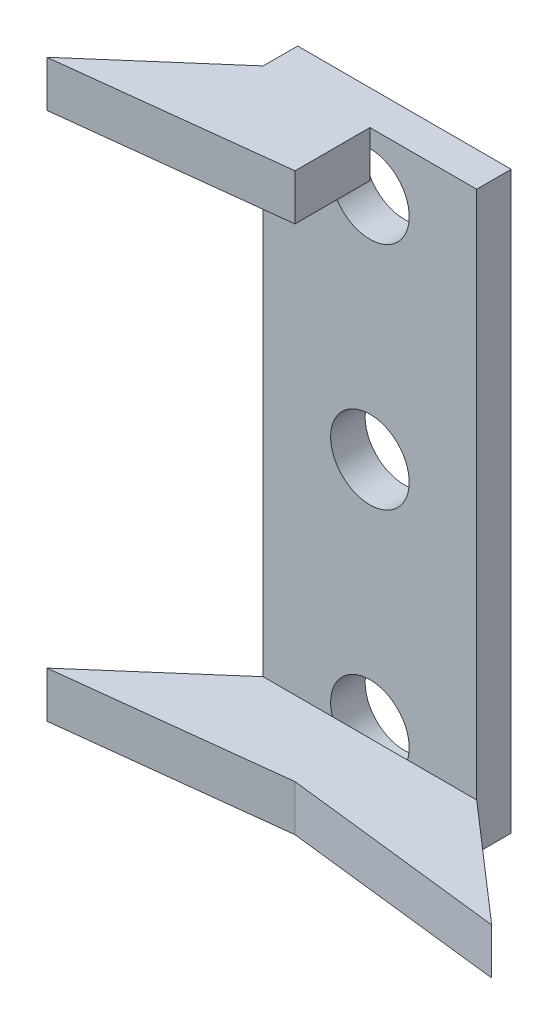
ISO-10303-21;
HEADER;
FILE_DESCRIPTION(('STEP AP214'),'2;1');
FILE_NAME('part.step','',(''),(''),'','','');
FILE_SCHEMA(('AUTOMOTIVE_DESIGN { 1 0 10303 214 1 1 1 1 }'));
ENDSEC;
DATA;
#1=APPLICATION_CONTEXT('core data for automotive mechanical design processes');
#2=APPLICATION_PROTOCOL_DEFINITION('international standard','automotive_design',2000,#1);
#3=PRODUCT_CONTEXT('',#1,'mechanical');
#4=PRODUCT('Part','Part','',(#3));
#5=PRODUCT_RELATED_PRODUCT_CATEGORY('part','',(#4));
#6=PRODUCT_DEFINITION_FORMATION('','',#4);
#7=PRODUCT_DEFINITION_CONTEXT('part definition',#1,'design');
#8=PRODUCT_DEFINITION('design','',#6,#7);
#9=PRODUCT_DEFINITION_SHAPE('','',#8);
#10=(LENGTH_UNIT() NAMED_UNIT(*) SI_UNIT(.MILLI.,.METRE.));
#11=(NAMED_UNIT(*) PLANE_ANGLE_UNIT() SI_UNIT($,.RADIAN.));
#12=(NAMED_UNIT(*) SI_UNIT($,.STERADIAN.) SOLID_ANGLE_UNIT());
#13=UNCERTAINTY_MEASURE_WITH_UNIT(LENGTH_MEASURE(1.E-05),#10,'distance_accuracy_value','');
#14=(GEOMETRIC_REPRESENTATION_CONTEXT(3) GLOBAL_UNCERTAINTY_ASSIGNED_CONTEXT((#13)) GLOBAL_UNIT_ASSIGNED_CONTEXT((#10,
#11,#12)) REPRESENTATION_CONTEXT('',''));
#15=CARTESIAN_POINT('',(0.,0.,0.));
#16=DIRECTION('',(0.,0.,1.));
#17=DIRECTION('',(1.,0.,0.));
#18=AXIS2_PLACEMENT_3D('',#15,#16,#17);
#19=CARTESIAN_POINT('',(-147.00484014835,40.,54.9741091967513));
#20=DIRECTION('',(-0.115020986115073,0.,-0.993363061902906));
#21=DIRECTION('',(-0.993363061902906,0.,0.115020986115073));
#22=AXIS2_PLACEMENT_3D('',#19,#20,#21);
#23=PLANE('',#22);
#24=DIRECTION('',(0.993363061902906,0.,-0.115020986115073));
#25=VECTOR('',#24,1.);
#26=CARTESIAN_POINT('',(-147.00484014835,0.,54.9741091967513));
#27=LINE('',#26,#25);
#28=CARTESIAN_POINT('',(-147.00484014835,0.,54.9741091967513));
#29=VERTEX_POINT('',#28);
#30=CARTESIAN_POINT('',(46.4225810994789,0.,32.5772498943712));
#31=VERTEX_POINT('',#30);
#32=EDGE_CURVE('E233',#29,#31,#27,.T.);
#33=ORIENTED_EDGE('',*,*,#32,.T.);
#34=DIRECTION('',(0.,-1.,0.));
#35=VECTOR('',#34,1.);
#36=CARTESIAN_POINT('',(46.4225810994789,40.,32.5772498943712));
#37=LINE('',#36,#35);
#38=CARTESIAN_POINT('',(46.4225810994789,40.,32.5772498943712));
#39=VERTEX_POINT('',#38);
#40=EDGE_CURVE('E44',#39,#31,#37,.T.);
#41=ORIENTED_EDGE('',*,*,#40,.F.);
#42=DIRECTION('',(0.993363061902906,0.,-0.115020986115073));
#43=VECTOR('',#42,1.);
#44=CARTESIAN_POINT('',(-147.00484014835,40.,54.9741091967513));
#45=LINE('',#44,#43);
#46=CARTESIAN_POINT('',(-147.00484014835,40.,54.9741091967513));
#47=VERTEX_POINT('',#46);
#48=EDGE_CURVE('E234',#47,#39,#45,.T.);
#49=ORIENTED_EDGE('',*,*,#48,.F.);
#50=DIRECTION('',(0.,-1.,0.));
#51=VECTOR('',#50,1.);
#52=CARTESIAN_POINT('',(-147.00484014835,40.,54.9741091967513));
#53=LINE('',#52,#51);
#54=EDGE_CURVE('E244',#47,#29,#53,.T.);
#55=ORIENTED_EDGE('',*,*,#54,.T.);
#56=EDGE_LOOP('',(#33,#41,#49,#55));
#57=FACE_BOUND('',#56,.T.);
#58=ADVANCED_FACE('F37',(#57),#23,.F.);
#59=CARTESIAN_POINT('',(-46.4225810994789,40.,-32.5772498943712));
#60=DIRECTION('',(0.656556653543438,0.,0.754276713605717));
#61=DIRECTION('',(0.754276713605717,0.,-0.656556653543438));
#62=AXIS2_PLACEMENT_3D('',#59,#60,#61);
#63=PLANE('',#62);
#64=DIRECTION('',(-0.754276713605717,0.,0.656556653543438));
#65=VECTOR('',#64,1.);
#66=CARTESIAN_POINT('',(-46.4225810994789,0.,-32.5772498943712));
#67=LINE('',#66,#65);
#68=CARTESIAN_POINT('',(-46.4225810994789,0.,-32.5772498943712));
#69=VERTEX_POINT('',#68);
#70=EDGE_CURVE('E237',#69,#29,#67,.T.);
#71=ORIENTED_EDGE('',*,*,#70,.T.);
#72=ORIENTED_EDGE('',*,*,#54,.F.);
#73=DIRECTION('',(-0.754276713605717,0.,0.656556653543438));
#74=VECTOR('',#73,1.);
#75=CARTESIAN_POINT('',(-46.4225810994789,40.,-32.5772498943712));
#76=LINE('',#75,#74);
#77=CARTESIAN_POINT('',(-46.4225810994789,40.,-32.5772498943712));
#78=VERTEX_POINT('',#77);
#79=EDGE_CURVE('E241',#78,#47,#76,.T.);
#80=ORIENTED_EDGE('',*,*,#79,.F.);
#81=DIRECTION('',(0.,-1.,0.));
#82=VECTOR('',#81,1.);
#83=CARTESIAN_POINT('',(-46.4225810994789,40.,-32.5772498943712));
#84=LINE('',#83,#82);
#85=EDGE_CURVE('E249',#78,#69,#84,.T.);
#86=ORIENTED_EDGE('',*,*,#85,.T.);
#87=EDGE_LOOP('',(#71,#72,#80,#86));
#88=FACE_BOUND('',#87,.T.);
#89=ADVANCED_FACE('F275',(#88),#63,.F.);
#90=CARTESIAN_POINT('',(0.,40.,0.));
#91=DIRECTION('',(0.,-1.,0.));
#92=DIRECTION('',(0.,0.,-1.));
#93=AXIS2_PLACEMENT_3D('',#90,#91,#92);
#94=PLANE('',#93);
#95=ORIENTED_EDGE('',*,*,#48,.T.);
#96=DIRECTION('',(-0.993363061902906,0.,-0.115020986115073));
#97=VECTOR('',#96,1.);
#98=CARTESIAN_POINT('',(239.850002347308,40.,54.9741091967513));
#99=LINE('',#98,#97);
#100=CARTESIAN_POINT('',(239.850002347308,40.,54.9741091967513));
#101=VERTEX_POINT('',#100);
#102=EDGE_CURVE('E218',#101,#39,#99,.T.);
#103=ORIENTED_EDGE('',*,*,#102,.F.);
#104=DIRECTION('',(0.754276713605717,0.,0.656556653543438));
#105=VECTOR('',#104,1.);
#106=CARTESIAN_POINT('',(139.267743298437,40.,-32.5772498943712));
#107=LINE('',#106,#105);
#108=CARTESIAN_POINT('',(139.267743298437,40.,-32.5772498943712));
#109=VERTEX_POINT('',#108);
#110=EDGE_CURVE('E221',#109,#101,#107,.T.);
#111=ORIENTED_EDGE('',*,*,#110,.F.);
#112=DIRECTION('',(-1.,0.,0.));
#113=VECTOR('',#112,1.);
#114=CARTESIAN_POINT('',(-46.4225810994789,40.,-32.5772498943712));
#115=LINE('',#114,#113);
#116=CARTESIAN_POINT('',(79.102818327294,40.,-32.5772498943712));
#117=VERTEX_POINT('',#116);
#118=EDGE_CURVE('E238',#109,#117,#115,.T.);
#119=ORIENTED_EDGE('',*,*,#118,.T.);
#120=CARTESIAN_POINT('',(13.7423438716637,40.,-32.5772498943712));
#121=VERTEX_POINT('',#120);
#122=EDGE_CURVE('E242',#117,#121,#115,.T.);
#123=ORIENTED_EDGE('',*,*,#122,.T.);
#124=EDGE_CURVE('E236',#121,#78,#115,.T.);
#125=ORIENTED_EDGE('',*,*,#124,.T.);
#126=ORIENTED_EDGE('',*,*,#79,.T.);
#127=EDGE_LOOP('',(#95,#103,#111,#119,#123,#125,#126));
#128=FACE_BOUND('',#127,.T.);
#129=ADVANCED_FACE('F271',(#128),#94,.F.);
#130=CARTESIAN_POINT('',(0.,0.,0.));
#131=DIRECTION('',(0.,-1.,0.));
#132=DIRECTION('',(0.,0.,-1.));
#133=AXIS2_PLACEMENT_3D('',#130,#131,#132);
#134=PLANE('',#133);
#135=ORIENTED_EDGE('',*,*,#32,.F.);
#136=ORIENTED_EDGE('',*,*,#70,.F.);
#137=DIRECTION('',(0.,0.,1.));
#138=VECTOR('',#137,1.);
#139=CARTESIAN_POINT('',(-46.4225810994789,0.,-62.5772498943712));
#140=LINE('',#139,#138);
#141=CARTESIAN_POINT('',(-46.4225810994789,0.,-62.5772498943712));
#142=VERTEX_POINT('',#141);
#143=EDGE_CURVE('E201',#142,#69,#140,.T.);
#144=ORIENTED_EDGE('',*,*,#143,.F.);
#145=DIRECTION('',(-1.,0.,0.));
#146=VECTOR('',#145,1.);
#147=CARTESIAN_POINT('',(-46.4225810994789,0.,-62.5772498943712));
#148=LINE('',#147,#146);
#149=CARTESIAN_POINT('',(139.267743298437,0.,-62.5772498943712));
#150=VERTEX_POINT('',#149);
#151=EDGE_CURVE('E199',#150,#142,#148,.T.);
#152=ORIENTED_EDGE('',*,*,#151,.F.);
#153=DIRECTION('',(0.,0.,1.));
#154=VECTOR('',#153,1.);
#155=CARTESIAN_POINT('',(139.267743298437,0.,-62.5772498943712));
#156=LINE('',#155,#154);
#157=CARTESIAN_POINT('',(139.267743298437,0.,-32.5772498943712));
#158=VERTEX_POINT('',#157);
#159=EDGE_CURVE('E208',#150,#158,#156,.T.);
#160=ORIENTED_EDGE('',*,*,#159,.T.);
#161=DIRECTION('',(0.754276713605717,0.,0.656556653543438));
#162=VECTOR('',#161,1.);
#163=CARTESIAN_POINT('',(139.267743298437,0.,-32.5772498943712));
#164=LINE('',#163,#162);
#165=CARTESIAN_POINT('',(239.850002347308,0.,54.9741091967513));
#166=VERTEX_POINT('',#165);
#167=EDGE_CURVE('E222',#158,#166,#164,.T.);
#168=ORIENTED_EDGE('',*,*,#167,.T.);
#169=DIRECTION('',(-0.993363061902906,0.,-0.115020986115073));
#170=VECTOR('',#169,1.);
#171=CARTESIAN_POINT('',(239.850002347308,0.,54.9741091967513));
#172=LINE('',#171,#170);
#173=EDGE_CURVE('E217',#166,#31,#172,.T.);
#174=ORIENTED_EDGE('',*,*,#173,.T.);
#175=EDGE_LOOP('',(#135,#136,#144,#152,#160,#168,#174));
#176=FACE_BOUND('',#175,.T.);
#177=ADVANCED_FACE('F261',(#176),#134,.T.);
#178=CARTESIAN_POINT('',(239.850002347308,40.,54.9741091967513));
#179=DIRECTION('',(-0.115020986115073,0.,0.993363061902906));
#180=DIRECTION('',(0.993363061902906,0.,0.115020986115073));
#181=AXIS2_PLACEMENT_3D('',#178,#179,#180);
#182=PLANE('',#181);
#183=ORIENTED_EDGE('',*,*,#173,.F.);
#184=DIRECTION('',(0.,-1.,0.));
#185=VECTOR('',#184,1.);
#186=CARTESIAN_POINT('',(239.850002347308,40.,54.9741091967513));
#187=LINE('',#186,#185);
#188=EDGE_CURVE('E231',#101,#166,#187,.T.);
#189=ORIENTED_EDGE('',*,*,#188,.F.);
#190=ORIENTED_EDGE('',*,*,#102,.T.);
#191=ORIENTED_EDGE('',*,*,#40,.T.);
#192=EDGE_LOOP('',(#183,#189,#190,#191));
#193=FACE_BOUND('',#192,.T.);
#194=ADVANCED_FACE('F255',(#193),#182,.T.);
#195=CARTESIAN_POINT('',(139.267743298437,40.,-32.5772498943712));
#196=DIRECTION('',(0.656556653543438,0.,-0.754276713605717));
#197=DIRECTION('',(-0.754276713605717,0.,-0.656556653543438));
#198=AXIS2_PLACEMENT_3D('',#195,#196,#197);
#199=PLANE('',#198);
#200=ORIENTED_EDGE('',*,*,#167,.F.);
#201=DIRECTION('',(0.,-1.,0.));
#202=VECTOR('',#201,1.);
#203=CARTESIAN_POINT('',(139.267743298437,40.,-32.5772498943712));
#204=LINE('',#203,#202);
#205=EDGE_CURVE('E225',#109,#158,#204,.T.);
#206=ORIENTED_EDGE('',*,*,#205,.F.);
#207=ORIENTED_EDGE('',*,*,#110,.T.);
#208=ORIENTED_EDGE('',*,*,#188,.T.);
#209=EDGE_LOOP('',(#200,#206,#207,#208));
#210=FACE_BOUND('',#209,.T.);
#211=ADVANCED_FACE('F268',(#210),#199,.T.);
#212=CARTESIAN_POINT('',(-46.4225810994789,0.,-62.5772498943712));
#213=DIRECTION('',(1.,0.,0.));
#214=DIRECTION('',(0.,0.,-1.));
#215=AXIS2_PLACEMENT_3D('',#212,#213,#214);
#216=PLANE('',#215);
#217=ORIENTED_EDGE('',*,*,#85,.F.);
#218=DIRECTION('',(0.,1.,0.));
#219=VECTOR('',#218,1.);
#220=CARTESIAN_POINT('',(-46.4225810994789,0.,-32.5772498943712));
#221=LINE('',#220,#219);
#222=CARTESIAN_POINT('',(-46.4225810994789,460.,-32.5772498943712));
#223=VERTEX_POINT('',#222);
#224=EDGE_CURVE('E190',#78,#223,#221,.T.);
#225=ORIENTED_EDGE('',*,*,#224,.T.);
#226=DIRECTION('',(0.,1.,0.));
#227=VECTOR('',#226,1.);
#228=CARTESIAN_POINT('',(-46.4225810994789,460.,-32.5772498943712));
#229=LINE('',#228,#227);
#230=CARTESIAN_POINT('',(-46.4225810994789,500.,-32.5772498943712));
#231=VERTEX_POINT('',#230);
#232=EDGE_CURVE('E185',#223,#231,#229,.T.);
#233=ORIENTED_EDGE('',*,*,#232,.T.);
#234=DIRECTION('',(0.,0.,1.));
#235=VECTOR('',#234,1.);
#236=CARTESIAN_POINT('',(-46.4225810994789,500.,-62.5772498943712));
#237=LINE('',#236,#235);
#238=CARTESIAN_POINT('',(-46.4225810994789,500.,-62.5772498943712));
#239=VERTEX_POINT('',#238);
#240=EDGE_CURVE('E214',#239,#231,#237,.T.);
#241=ORIENTED_EDGE('',*,*,#240,.F.);
#242=DIRECTION('',(0.,1.,0.));
#243=VECTOR('',#242,1.);
#244=CARTESIAN_POINT('',(-46.4225810994789,0.,-62.5772498943712));
#245=LINE('',#244,#243);
#246=EDGE_CURVE('E191',#142,#239,#245,.T.);
#247=ORIENTED_EDGE('',*,*,#246,.F.);
#248=ORIENTED_EDGE('',*,*,#143,.T.);
#249=EDGE_LOOP('',(#217,#225,#233,#241,#247,#248));
#250=FACE_BOUND('',#249,.T.);
#251=ADVANCED_FACE('F281',(#250),#216,.F.);
#252=CARTESIAN_POINT('',(-46.4225810994789,500.,-62.5772498943712));
#253=DIRECTION('',(0.,-1.,0.));
#254=DIRECTION('',(0.,0.,-1.));
#255=AXIS2_PLACEMENT_3D('',#252,#253,#254);
#256=PLANE('',#255);
#257=ORIENTED_EDGE('',*,*,#240,.T.);
#258=DIRECTION('',(-0.754276713605717,0.,0.656556653543438));
#259=VECTOR('',#258,1.);
#260=CARTESIAN_POINT('',(-46.4225810994789,500.,-32.5772498943712));
#261=LINE('',#260,#259);
#262=CARTESIAN_POINT('',(-147.00484014835,500.,54.9741091967513));
#263=VERTEX_POINT('',#262);
#264=EDGE_CURVE('E177',#231,#263,#261,.T.);
#265=ORIENTED_EDGE('',*,*,#264,.T.);
#266=DIRECTION('',(0.993363061902906,0.,-0.115020986115073));
#267=VECTOR('',#266,1.);
#268=CARTESIAN_POINT('',(-147.00484014835,500.,54.9741091967513));
#269=LINE('',#268,#267);
#270=CARTESIAN_POINT('',(46.4225810994789,500.,32.5772498943712));
#271=VERTEX_POINT('',#270);
#272=EDGE_CURVE('E174',#263,#271,#269,.T.);
#273=ORIENTED_EDGE('',*,*,#272,.T.);
#274=DIRECTION('',(0.,0.,-1.));
#275=VECTOR('',#274,1.);
#276=CARTESIAN_POINT('',(46.4225810994789,500.,-32.5772498943712));
#277=LINE('',#276,#275);
#278=CARTESIAN_POINT('',(46.4225810994789,500.,-32.5772498943712));
#279=VERTEX_POINT('',#278);
#280=EDGE_CURVE('E181',#271,#279,#277,.T.);
#281=ORIENTED_EDGE('',*,*,#280,.T.);
#282=DIRECTION('',(1.,0.,0.));
#283=VECTOR('',#282,1.);
#284=CARTESIAN_POINT('',(-46.4225810994789,500.,-32.5772498943712));
#285=LINE('',#284,#283);
#286=CARTESIAN_POINT('',(139.267743298437,500.,-32.5772498943712));
#287=VERTEX_POINT('',#286);
#288=EDGE_CURVE('E203',#279,#287,#285,.T.);
#289=ORIENTED_EDGE('',*,*,#288,.T.);
#290=DIRECTION('',(0.,0.,1.));
#291=VECTOR('',#290,1.);
#292=CARTESIAN_POINT('',(139.267743298437,500.,-62.5772498943712));
#293=LINE('',#292,#291);
#294=CARTESIAN_POINT('',(139.267743298437,500.,-62.5772498943712));
#295=VERTEX_POINT('',#294);
#296=EDGE_CURVE('E211',#295,#287,#293,.T.);
#297=ORIENTED_EDGE('',*,*,#296,.F.);
#298=DIRECTION('',(1.,0.,0.));
#299=VECTOR('',#298,1.);
#300=CARTESIAN_POINT('',(-46.4225810994789,500.,-62.5772498943712));
#301=LINE('',#300,#299);
#302=EDGE_CURVE('E194',#239,#295,#301,.T.);
#303=ORIENTED_EDGE('',*,*,#302,.F.);
#304=EDGE_LOOP('',(#257,#265,#273,#281,#289,#297,#303));
#305=FACE_BOUND('',#304,.T.);
#306=ADVANCED_FACE('F296',(#305),#256,.F.);
#307=CARTESIAN_POINT('',(139.267743298437,0.,-62.5772498943712));
#308=DIRECTION('',(-1.,0.,0.));
#309=DIRECTION('',(0.,0.,1.));
#310=AXIS2_PLACEMENT_3D('',#307,#308,#309);
#311=PLANE('',#310);
#312=DIRECTION('',(0.,-1.,0.));
#313=VECTOR('',#312,1.);
#314=CARTESIAN_POINT('',(139.267743298437,0.,-32.5772498943712));
#315=LINE('',#314,#313);
#316=EDGE_CURVE('E195',#287,#109,#315,.T.);
#317=ORIENTED_EDGE('',*,*,#316,.T.);
#318=ORIENTED_EDGE('',*,*,#205,.T.);
#319=ORIENTED_EDGE('',*,*,#159,.F.);
#320=DIRECTION('',(0.,-1.,0.));
#321=VECTOR('',#320,1.);
#322=CARTESIAN_POINT('',(139.267743298437,0.,-62.5772498943712));
#323=LINE('',#322,#321);
#324=EDGE_CURVE('E197',#295,#150,#323,.T.);
#325=ORIENTED_EDGE('',*,*,#324,.F.);
#326=ORIENTED_EDGE('',*,*,#296,.T.);
#327=EDGE_LOOP('',(#317,#318,#319,#325,#326));
#328=FACE_BOUND('',#327,.T.);
#329=ADVANCED_FACE('F287',(#328),#311,.F.);
#330=CARTESIAN_POINT('',(0.,0.,-62.5772498943712));
#331=DIRECTION('',(0.,0.,-1.));
#332=DIRECTION('',(-1.,0.,0.));
#333=AXIS2_PLACEMENT_3D('',#330,#331,#332);
#334=PLANE('',#333);
#335=CARTESIAN_POINT('',(46.4225810994789,50.,-62.5772498943712));
#336=DIRECTION('',(0.,0.,-1.));
#337=DIRECTION('',(-1.,0.,0.));
#338=AXIS2_PLACEMENT_3D('',#335,#336,#337);
#339=CIRCLE('',#338,34.1759843350016);
#340=CARTESIAN_POINT('',(12.2465967644773,50.,-62.5772498943712));
#341=VERTEX_POINT('',#340);
#342=EDGE_CURVE('E153',#341,#341,#339,.T.);
#343=ORIENTED_EDGE('',*,*,#342,.F.);
#344=EDGE_LOOP('',(#343));
#345=FACE_BOUND('',#344,.T.);
#346=CARTESIAN_POINT('',(46.4225810994789,450.,-62.5772498943712));
#347=DIRECTION('',(0.,0.,-1.));
#348=DIRECTION('',(-1.,0.,0.));
#349=AXIS2_PLACEMENT_3D('',#346,#347,#348);
#350=CIRCLE('',#349,34.1759843350016);
#351=CARTESIAN_POINT('',(12.2465967644773,450.,-62.5772498943712));
#352=VERTEX_POINT('',#351);
#353=EDGE_CURVE('E161',#352,#352,#350,.T.);
#354=ORIENTED_EDGE('',*,*,#353,.F.);
#355=EDGE_LOOP('',(#354));
#356=FACE_BOUND('',#355,.T.);
#357=CARTESIAN_POINT('',(46.4225810994789,250.,-62.5772498943712));
#358=DIRECTION('',(0.,0.,-1.));
#359=DIRECTION('',(-1.,0.,0.));
#360=AXIS2_PLACEMENT_3D('',#357,#358,#359);
#361=CIRCLE('',#360,34.1759843350016);
#362=CARTESIAN_POINT('',(12.2465967644773,250.,-62.5772498943712));
#363=VERTEX_POINT('',#362);
#364=EDGE_CURVE('E292',#363,#363,#361,.T.);
#365=ORIENTED_EDGE('',*,*,#364,.F.);
#366=EDGE_LOOP('',(#365));
#367=FACE_BOUND('',#366,.T.);
#368=ORIENTED_EDGE('',*,*,#246,.T.);
#369=ORIENTED_EDGE('',*,*,#302,.T.);
#370=ORIENTED_EDGE('',*,*,#324,.T.);
#371=ORIENTED_EDGE('',*,*,#151,.T.);
#372=EDGE_LOOP('',(#368,#369,#370,#371));
#373=FACE_BOUND('',#372,.T.);
#374=ADVANCED_FACE('F283',(#345,#356,#367,#373),#334,.T.);
#375=CARTESIAN_POINT('',(0.,0.,-32.5772498943712));
#376=DIRECTION('',(0.,0.,-1.));
#377=DIRECTION('',(-1.,0.,0.));
#378=AXIS2_PLACEMENT_3D('',#375,#376,#377);
#379=PLANE('',#378);
#380=CARTESIAN_POINT('',(46.4225810994789,250.,-32.5772498943712));
#381=DIRECTION('',(0.,0.,-1.));
#382=DIRECTION('',(-1.,0.,0.));
#383=AXIS2_PLACEMENT_3D('',#380,#381,#382);
#384=CIRCLE('',#383,34.1759843350016);
#385=CARTESIAN_POINT('',(12.2465967644773,250.,-32.5772498943712));
#386=VERTEX_POINT('',#385);
#387=EDGE_CURVE('E178',#386,#386,#384,.T.);
#388=ORIENTED_EDGE('',*,*,#387,.T.);
#389=EDGE_LOOP('',(#388));
#390=FACE_BOUND('',#389,.T.);
#391=ORIENTED_EDGE('',*,*,#124,.F.);
#392=CARTESIAN_POINT('',(46.4225810994789,50.,-32.5772498943712));
#393=DIRECTION('',(0.,0.,-1.));
#394=DIRECTION('',(-1.,0.,0.));
#395=AXIS2_PLACEMENT_3D('',#392,#393,#394);
#396=CIRCLE('',#395,34.1759843350016);
#397=EDGE_CURVE('E11',#121,#117,#396,.T.);
#398=ORIENTED_EDGE('',*,*,#397,.T.);
#399=ORIENTED_EDGE('',*,*,#118,.F.);
#400=ORIENTED_EDGE('',*,*,#316,.F.);
#401=ORIENTED_EDGE('',*,*,#288,.F.);
#402=DIRECTION('',(0.,1.,0.));
#403=VECTOR('',#402,1.);
#404=CARTESIAN_POINT('',(46.4225810994789,460.,-32.5772498943712));
#405=LINE('',#404,#403);
#406=CARTESIAN_POINT('',(46.4225810994789,484.175984335002,-32.5772498943712));
#407=VERTEX_POINT('',#406);
#408=EDGE_CURVE('E58',#407,#279,#405,.T.);
#409=ORIENTED_EDGE('',*,*,#408,.F.);
#410=CARTESIAN_POINT('',(46.4225810994789,450.,-32.5772498943712));
#411=DIRECTION('',(0.,0.,-1.));
#412=DIRECTION('',(-1.,0.,0.));
#413=AXIS2_PLACEMENT_3D('',#410,#411,#412);
#414=CIRCLE('',#413,34.1759843350016);
#415=CARTESIAN_POINT('',(13.7423438716637,460.,-32.5772498943712));
#416=VERTEX_POINT('',#415);
#417=EDGE_CURVE('E152',#407,#416,#414,.T.);
#418=ORIENTED_EDGE('',*,*,#417,.T.);
#419=DIRECTION('',(-1.,0.,0.));
#420=VECTOR('',#419,1.);
#421=CARTESIAN_POINT('',(-46.4225810994789,460.,-32.5772498943712));
#422=LINE('',#421,#420);
#423=EDGE_CURVE('E146',#416,#223,#422,.T.);
#424=ORIENTED_EDGE('',*,*,#423,.T.);
#425=ORIENTED_EDGE('',*,*,#224,.F.);
#426=EDGE_LOOP('',(#391,#398,#399,#400,#401,#409,#418,#424,#425));
#427=FACE_BOUND('',#426,.T.);
#428=ADVANCED_FACE('F157',(#390,#427),#379,.F.);
#429=CARTESIAN_POINT('',(-147.00484014835,460.,54.9741091967513));
#430=DIRECTION('',(0.115020986115073,0.,0.993363061902906));
#431=DIRECTION('',(0.993363061902906,0.,-0.115020986115073));
#432=AXIS2_PLACEMENT_3D('',#429,#430,#431);
#433=PLANE('',#432);
#434=ORIENTED_EDGE('',*,*,#272,.F.);
#435=DIRECTION('',(0.,1.,0.));
#436=VECTOR('',#435,1.);
#437=CARTESIAN_POINT('',(-147.00484014835,460.,54.9741091967513));
#438=LINE('',#437,#436);
#439=CARTESIAN_POINT('',(-147.00484014835,460.,54.9741091967513));
#440=VERTEX_POINT('',#439);
#441=EDGE_CURVE('E188',#440,#263,#438,.T.);
#442=ORIENTED_EDGE('',*,*,#441,.F.);
#443=DIRECTION('',(0.993363061902906,0.,-0.115020986115073));
#444=VECTOR('',#443,1.);
#445=CARTESIAN_POINT('',(-147.00484014835,460.,54.9741091967513));
#446=LINE('',#445,#444);
#447=CARTESIAN_POINT('',(46.4225810994789,460.,32.5772498943712));
#448=VERTEX_POINT('',#447);
#449=EDGE_CURVE('E168',#440,#448,#446,.T.);
#450=ORIENTED_EDGE('',*,*,#449,.T.);
#451=DIRECTION('',(0.,1.,0.));
#452=VECTOR('',#451,1.);
#453=CARTESIAN_POINT('',(46.4225810994789,460.,32.5772498943712));
#454=LINE('',#453,#452);
#455=EDGE_CURVE('E173',#448,#271,#454,.T.);
#456=ORIENTED_EDGE('',*,*,#455,.T.);
#457=EDGE_LOOP('',(#434,#442,#450,#456));
#458=FACE_BOUND('',#457,.T.);
#459=ADVANCED_FACE('F301',(#458),#433,.T.);
#460=CARTESIAN_POINT('',(-46.4225810994789,460.,-32.5772498943712));
#461=DIRECTION('',(-0.656556653543438,0.,-0.754276713605717));
#462=DIRECTION('',(-0.754276713605717,0.,0.656556653543438));
#463=AXIS2_PLACEMENT_3D('',#460,#461,#462);
#464=PLANE('',#463);
#465=ORIENTED_EDGE('',*,*,#264,.F.);
#466=ORIENTED_EDGE('',*,*,#232,.F.);
#467=DIRECTION('',(-0.754276713605717,0.,0.656556653543438));
#468=VECTOR('',#467,1.);
#469=CARTESIAN_POINT('',(-46.4225810994789,460.,-32.5772498943712));
#470=LINE('',#469,#468);
#471=EDGE_CURVE('E166',#223,#440,#470,.T.);
#472=ORIENTED_EDGE('',*,*,#471,.T.);
#473=ORIENTED_EDGE('',*,*,#441,.T.);
#474=EDGE_LOOP('',(#465,#466,#472,#473));
#475=FACE_BOUND('',#474,.T.);
#476=ADVANCED_FACE('F358',(#475),#464,.T.);
#477=CARTESIAN_POINT('',(46.4225810994789,460.,-32.5772498943712));
#478=DIRECTION('',(1.,0.,0.));
#479=DIRECTION('',(0.,0.,-1.));
#480=AXIS2_PLACEMENT_3D('',#477,#478,#479);
#481=PLANE('',#480);
#482=ORIENTED_EDGE('',*,*,#280,.F.);
#483=ORIENTED_EDGE('',*,*,#455,.F.);
#484=DIRECTION('',(0.,0.,-1.));
#485=VECTOR('',#484,1.);
#486=CARTESIAN_POINT('',(46.4225810994789,460.,-32.5772498943712));
#487=LINE('',#486,#485);
#488=CARTESIAN_POINT('',(46.4225810994789,460.,-32.5772498943712));
#489=VERTEX_POINT('',#488);
#490=EDGE_CURVE('E145',#448,#489,#487,.T.);
#491=ORIENTED_EDGE('',*,*,#490,.T.);
#492=EDGE_CURVE('E140',#489,#407,#405,.T.);
#493=ORIENTED_EDGE('',*,*,#492,.T.);
#494=ORIENTED_EDGE('',*,*,#408,.T.);
#495=EDGE_LOOP('',(#482,#483,#491,#493,#494));
#496=FACE_BOUND('',#495,.T.);
#497=ADVANCED_FACE('F298',(#496),#481,.T.);
#498=CARTESIAN_POINT('',(0.,460.,0.));
#499=DIRECTION('',(0.,1.,0.));
#500=DIRECTION('',(0.,0.,-1.));
#501=AXIS2_PLACEMENT_3D('',#498,#499,#500);
#502=PLANE('',#501);
#503=ORIENTED_EDGE('',*,*,#449,.F.);
#504=ORIENTED_EDGE('',*,*,#471,.F.);
#505=ORIENTED_EDGE('',*,*,#423,.F.);
#506=EDGE_CURVE('E136',#489,#416,#422,.T.);
#507=ORIENTED_EDGE('',*,*,#506,.F.);
#508=ORIENTED_EDGE('',*,*,#490,.F.);
#509=EDGE_LOOP('',(#503,#504,#505,#507,#508));
#510=FACE_BOUND('',#509,.T.);
#511=ADVANCED_FACE('F164',(#510),#502,.F.);
#512=CARTESIAN_POINT('',(46.4225810994789,250.,-32.5772498943712));
#513=DIRECTION('',(0.,0.,-1.));
#514=DIRECTION('',(-1.,0.,0.));
#515=AXIS2_PLACEMENT_3D('',#512,#513,#514);
#516=CYLINDRICAL_SURFACE('',#515,34.1759843350016);
#517=ORIENTED_EDGE('',*,*,#387,.F.);
#518=EDGE_LOOP('',(#517));
#519=FACE_BOUND('',#518,.T.);
#520=ORIENTED_EDGE('',*,*,#364,.T.);
#521=EDGE_LOOP('',(#520));
#522=FACE_BOUND('',#521,.T.);
#523=ADVANCED_FACE('F321',(#519,#522),#516,.F.);
#524=CARTESIAN_POINT('',(46.4225810994789,450.,-32.5772498943712));
#525=DIRECTION('',(0.,0.,-1.));
#526=DIRECTION('',(-1.,0.,0.));
#527=AXIS2_PLACEMENT_3D('',#524,#525,#526);
#528=CYLINDRICAL_SURFACE('',#527,34.1759843350016);
#529=EDGE_CURVE('E139',#416,#407,#414,.T.);
#530=ORIENTED_EDGE('',*,*,#529,.F.);
#531=ORIENTED_EDGE('',*,*,#417,.F.);
#532=EDGE_LOOP('',(#530,#531));
#533=FACE_BOUND('',#532,.T.);
#534=ORIENTED_EDGE('',*,*,#353,.T.);
#535=EDGE_LOOP('',(#534));
#536=FACE_BOUND('',#535,.T.);
#537=ADVANCED_FACE('F150',(#533,#536),#528,.F.);
#538=CARTESIAN_POINT('',(46.4225810994789,450.,-32.5772498943712));
#539=DIRECTION('',(0.,0.,-1.));
#540=DIRECTION('',(-1.,0.,0.));
#541=AXIS2_PLACEMENT_3D('',#538,#539,#540);
#542=PLANE('',#541);
#543=ORIENTED_EDGE('',*,*,#506,.T.);
#544=ORIENTED_EDGE('',*,*,#529,.T.);
#545=ORIENTED_EDGE('',*,*,#492,.F.);
#546=EDGE_LOOP('',(#543,#544,#545));
#547=FACE_BOUND('',#546,.T.);
#548=ADVANCED_FACE('F138',(#547),#542,.T.);
#549=CARTESIAN_POINT('',(46.4225810994789,50.,-32.5772498943712));
#550=DIRECTION('',(0.,0.,-1.));
#551=DIRECTION('',(-1.,0.,0.));
#552=AXIS2_PLACEMENT_3D('',#549,#550,#551);
#553=PLANE('',#552);
#554=ORIENTED_EDGE('',*,*,#122,.F.);
#555=CARTESIAN_POINT('',(46.4225810994789,50.,-32.5772498943712));
#556=DIRECTION('',(0.,0.,-1.));
#557=DIRECTION('',(-1.,0.,0.));
#558=AXIS2_PLACEMENT_3D('',#555,#556,#557);
#559=CIRCLE('',#558,34.1759843350016);
#560=EDGE_CURVE('E50',#117,#121,#559,.T.);
#561=ORIENTED_EDGE('',*,*,#560,.T.);
#562=EDGE_LOOP('',(#554,#561));
#563=FACE_BOUND('',#562,.T.);
#564=ADVANCED_FACE('F291',(#563),#553,.T.);
#565=CARTESIAN_POINT('',(46.4225810994789,50.,-32.5772498943712));
#566=DIRECTION('',(0.,0.,-1.));
#567=DIRECTION('',(-1.,0.,0.));
#568=AXIS2_PLACEMENT_3D('',#565,#566,#567);
#569=CYLINDRICAL_SURFACE('',#568,34.1759843350016);
#570=ORIENTED_EDGE('',*,*,#560,.F.);
#571=ORIENTED_EDGE('',*,*,#397,.F.);
#572=EDGE_LOOP('',(#570,#571));
#573=FACE_BOUND('',#572,.T.);
#574=ORIENTED_EDGE('',*,*,#342,.T.);
#575=EDGE_LOOP('',(#574));
#576=FACE_BOUND('',#575,.T.);
#577=ADVANCED_FACE('F312',(#573,#576),#569,.F.);
#578=CLOSED_SHELL('',(#58,#89,#129,#177,#194,#211,#251,#306,#329,#374,#428,#459,#476,#497,#511,
#523,#537,#548,#564,#577));
#579=MANIFOLD_SOLID_BREP('B2',#578);
#580=ADVANCED_BREP_SHAPE_REPRESENTATION('',(#18,#579),#14);
#581=SHAPE_DEFINITION_REPRESENTATION(#9,#580);
ENDSEC;
END-ISO-10303-21;
